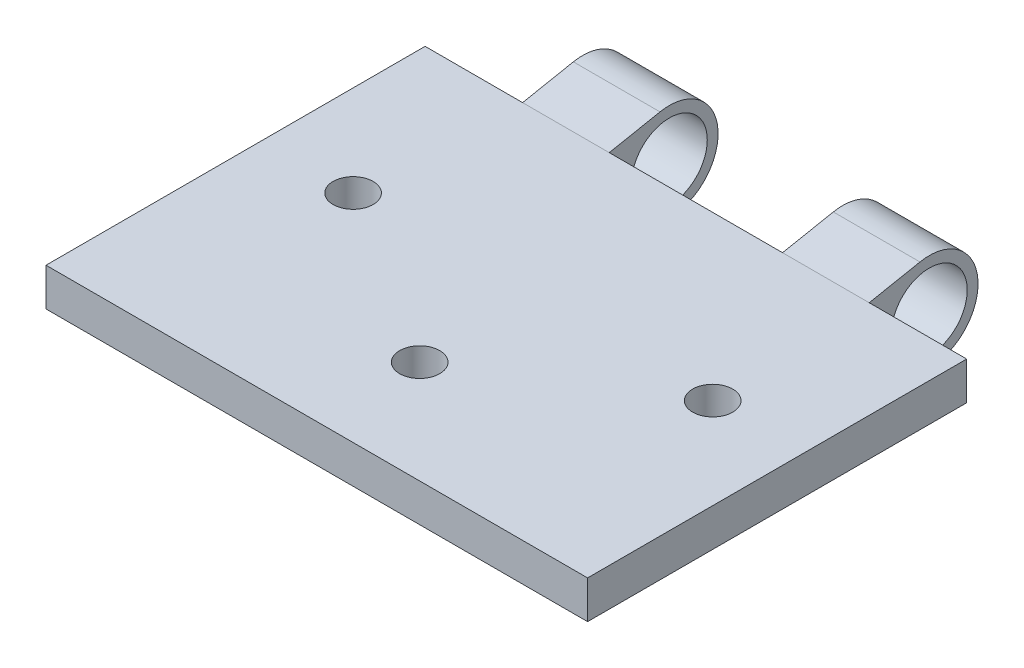
ISO-10303-21;
HEADER;
FILE_DESCRIPTION(('STEP AP214'),'2;1');
FILE_NAME('part.step','',(''),(''),'','','');
FILE_SCHEMA(('AUTOMOTIVE_DESIGN { 1 0 10303 214 1 1 1 1 }'));
ENDSEC;
DATA;
#1=APPLICATION_CONTEXT('core data for automotive mechanical design processes');
#2=APPLICATION_PROTOCOL_DEFINITION('international standard','automotive_design',2000,#1);
#3=PRODUCT_CONTEXT('',#1,'mechanical');
#4=PRODUCT('Part','Part','',(#3));
#5=PRODUCT_RELATED_PRODUCT_CATEGORY('part','',(#4));
#6=PRODUCT_DEFINITION_FORMATION('','',#4);
#7=PRODUCT_DEFINITION_CONTEXT('part definition',#1,'design');
#8=PRODUCT_DEFINITION('design','',#6,#7);
#9=PRODUCT_DEFINITION_SHAPE('','',#8);
#10=(LENGTH_UNIT() NAMED_UNIT(*) SI_UNIT(.MILLI.,.METRE.));
#11=(NAMED_UNIT(*) PLANE_ANGLE_UNIT() SI_UNIT($,.RADIAN.));
#12=(NAMED_UNIT(*) SI_UNIT($,.STERADIAN.) SOLID_ANGLE_UNIT());
#13=UNCERTAINTY_MEASURE_WITH_UNIT(LENGTH_MEASURE(1.E-05),#10,'distance_accuracy_value','');
#14=(GEOMETRIC_REPRESENTATION_CONTEXT(3) GLOBAL_UNCERTAINTY_ASSIGNED_CONTEXT((#13)) GLOBAL_UNIT_ASSIGNED_CONTEXT((#10,
#11,#12)) REPRESENTATION_CONTEXT('',''));
#15=CARTESIAN_POINT('',(0.,0.,0.));
#16=DIRECTION('',(0.,0.,1.));
#17=DIRECTION('',(1.,0.,0.));
#18=AXIS2_PLACEMENT_3D('',#15,#16,#17);
#19=CARTESIAN_POINT('',(-25.,3.5,-17.5));
#20=DIRECTION('',(0.,0.,-1.));
#21=DIRECTION('',(-1.,0.,0.));
#22=AXIS2_PLACEMENT_3D('',#19,#20,#21);
#23=PLANE('',#22);
#24=DIRECTION('',(1.,0.,0.));
#25=VECTOR('',#24,1.);
#26=CARTESIAN_POINT('',(-25.,0.,-17.5));
#27=LINE('',#26,#25);
#28=CARTESIAN_POINT('',(-8.00000000000001,0.,-17.5));
#29=VERTEX_POINT('',#28);
#30=CARTESIAN_POINT('',(7.99999999999999,0.,-17.5));
#31=VERTEX_POINT('',#30);
#32=EDGE_CURVE('E265',#29,#31,#27,.T.);
#33=ORIENTED_EDGE('',*,*,#32,.F.);
#34=DIRECTION('',(0.,-1.,0.));
#35=VECTOR('',#34,1.);
#36=CARTESIAN_POINT('',(-8.,3.5,-17.5));
#37=LINE('',#36,#35);
#38=CARTESIAN_POINT('',(-8.,3.5,-17.5));
#39=VERTEX_POINT('',#38);
#40=EDGE_CURVE('E240',#39,#29,#37,.T.);
#41=ORIENTED_EDGE('',*,*,#40,.F.);
#42=DIRECTION('',(1.,0.,0.));
#43=VECTOR('',#42,1.);
#44=CARTESIAN_POINT('',(-25.,3.5,-17.5));
#45=LINE('',#44,#43);
#46=CARTESIAN_POINT('',(7.99999999999999,3.5,-17.5));
#47=VERTEX_POINT('',#46);
#48=EDGE_CURVE('E155',#39,#47,#45,.T.);
#49=ORIENTED_EDGE('',*,*,#48,.T.);
#50=DIRECTION('',(0.,-1.,0.));
#51=VECTOR('',#50,1.);
#52=CARTESIAN_POINT('',(8.,3.5,-17.5));
#53=LINE('',#52,#51);
#54=EDGE_CURVE('E213',#47,#31,#53,.T.);
#55=ORIENTED_EDGE('',*,*,#54,.T.);
#56=EDGE_LOOP('',(#33,#41,#49,#55));
#57=FACE_BOUND('',#56,.T.);
#58=ADVANCED_FACE('F33',(#57),#23,.T.);
#59=DIRECTION('',(0.,-1.,0.));
#60=VECTOR('',#59,1.);
#61=CARTESIAN_POINT('',(-16.,3.5,-17.5));
#62=LINE('',#61,#60);
#63=CARTESIAN_POINT('',(-16.,3.5,-17.5));
#64=VERTEX_POINT('',#63);
#65=CARTESIAN_POINT('',(-16.,0.,-17.5));
#66=VERTEX_POINT('',#65);
#67=EDGE_CURVE('E125',#64,#66,#62,.T.);
#68=ORIENTED_EDGE('',*,*,#67,.T.);
#69=CARTESIAN_POINT('',(-25.,0.,-17.5));
#70=VERTEX_POINT('',#69);
#71=EDGE_CURVE('E269',#70,#66,#27,.T.);
#72=ORIENTED_EDGE('',*,*,#71,.F.);
#73=DIRECTION('',(0.,-1.,0.));
#74=VECTOR('',#73,1.);
#75=CARTESIAN_POINT('',(-25.,3.5,-17.5));
#76=LINE('',#75,#74);
#77=CARTESIAN_POINT('',(-25.,3.5,-17.5));
#78=VERTEX_POINT('',#77);
#79=EDGE_CURVE('E37',#78,#70,#76,.T.);
#80=ORIENTED_EDGE('',*,*,#79,.F.);
#81=EDGE_CURVE('E152',#78,#64,#45,.T.);
#82=ORIENTED_EDGE('',*,*,#81,.T.);
#83=EDGE_LOOP('',(#68,#72,#80,#82));
#84=FACE_BOUND('',#83,.T.);
#85=ADVANCED_FACE('F158',(#84),#23,.T.);
#86=CARTESIAN_POINT('',(-25.,3.5,17.5));
#87=DIRECTION('',(-1.,0.,0.));
#88=DIRECTION('',(0.,0.,1.));
#89=AXIS2_PLACEMENT_3D('',#86,#87,#88);
#90=PLANE('',#89);
#91=DIRECTION('',(0.,0.,-1.));
#92=VECTOR('',#91,1.);
#93=CARTESIAN_POINT('',(-25.,0.,17.5));
#94=LINE('',#93,#92);
#95=CARTESIAN_POINT('',(-25.,0.,17.5));
#96=VERTEX_POINT('',#95);
#97=EDGE_CURVE('E194',#96,#70,#94,.T.);
#98=ORIENTED_EDGE('',*,*,#97,.F.);
#99=DIRECTION('',(0.,-1.,0.));
#100=VECTOR('',#99,1.);
#101=CARTESIAN_POINT('',(-25.,3.5,17.5));
#102=LINE('',#101,#100);
#103=CARTESIAN_POINT('',(-25.,3.5,17.5));
#104=VERTEX_POINT('',#103);
#105=EDGE_CURVE('E11',#104,#96,#102,.T.);
#106=ORIENTED_EDGE('',*,*,#105,.F.);
#107=DIRECTION('',(0.,0.,-1.));
#108=VECTOR('',#107,1.);
#109=CARTESIAN_POINT('',(-25.,3.5,17.5));
#110=LINE('',#109,#108);
#111=EDGE_CURVE('E166',#104,#78,#110,.T.);
#112=ORIENTED_EDGE('',*,*,#111,.T.);
#113=ORIENTED_EDGE('',*,*,#79,.T.);
#114=EDGE_LOOP('',(#98,#106,#112,#113));
#115=FACE_BOUND('',#114,.T.);
#116=ADVANCED_FACE('F35',(#115),#90,.T.);
#117=CARTESIAN_POINT('',(25.,3.5,17.5));
#118=DIRECTION('',(0.,0.,1.));
#119=DIRECTION('',(1.,0.,0.));
#120=AXIS2_PLACEMENT_3D('',#117,#118,#119);
#121=PLANE('',#120);
#122=DIRECTION('',(-1.,0.,0.));
#123=VECTOR('',#122,1.);
#124=CARTESIAN_POINT('',(25.,0.,17.5));
#125=LINE('',#124,#123);
#126=CARTESIAN_POINT('',(25.,0.,17.5));
#127=VERTEX_POINT('',#126);
#128=EDGE_CURVE('E169',#127,#96,#125,.T.);
#129=ORIENTED_EDGE('',*,*,#128,.F.);
#130=DIRECTION('',(0.,-1.,0.));
#131=VECTOR('',#130,1.);
#132=CARTESIAN_POINT('',(25.,3.5,17.5));
#133=LINE('',#132,#131);
#134=CARTESIAN_POINT('',(25.,3.5,17.5));
#135=VERTEX_POINT('',#134);
#136=EDGE_CURVE('E42',#135,#127,#133,.T.);
#137=ORIENTED_EDGE('',*,*,#136,.F.);
#138=DIRECTION('',(-1.,0.,0.));
#139=VECTOR('',#138,1.);
#140=CARTESIAN_POINT('',(25.,3.5,17.5));
#141=LINE('',#140,#139);
#142=EDGE_CURVE('E163',#135,#104,#141,.T.);
#143=ORIENTED_EDGE('',*,*,#142,.T.);
#144=ORIENTED_EDGE('',*,*,#105,.T.);
#145=EDGE_LOOP('',(#129,#137,#143,#144));
#146=FACE_BOUND('',#145,.T.);
#147=ADVANCED_FACE('F301',(#146),#121,.T.);
#148=CARTESIAN_POINT('',(25.,3.5,-17.5));
#149=DIRECTION('',(1.,0.,0.));
#150=DIRECTION('',(0.,0.,-1.));
#151=AXIS2_PLACEMENT_3D('',#148,#149,#150);
#152=PLANE('',#151);
#153=DIRECTION('',(0.,0.,1.));
#154=VECTOR('',#153,1.);
#155=CARTESIAN_POINT('',(25.,0.,-17.5));
#156=LINE('',#155,#154);
#157=CARTESIAN_POINT('',(25.,0.,-17.5));
#158=VERTEX_POINT('',#157);
#159=EDGE_CURVE('E172',#158,#127,#156,.T.);
#160=ORIENTED_EDGE('',*,*,#159,.F.);
#161=DIRECTION('',(0.,-1.,0.));
#162=VECTOR('',#161,1.);
#163=CARTESIAN_POINT('',(25.,3.5,-17.5));
#164=LINE('',#163,#162);
#165=CARTESIAN_POINT('',(25.,3.5,-17.5));
#166=VERTEX_POINT('',#165);
#167=EDGE_CURVE('E490',#166,#158,#164,.T.);
#168=ORIENTED_EDGE('',*,*,#167,.F.);
#169=DIRECTION('',(0.,0.,1.));
#170=VECTOR('',#169,1.);
#171=CARTESIAN_POINT('',(25.,3.5,-17.5));
#172=LINE('',#171,#170);
#173=EDGE_CURVE('E159',#166,#135,#172,.T.);
#174=ORIENTED_EDGE('',*,*,#173,.T.);
#175=ORIENTED_EDGE('',*,*,#136,.T.);
#176=EDGE_LOOP('',(#160,#168,#174,#175));
#177=FACE_BOUND('',#176,.T.);
#178=ADVANCED_FACE('F294',(#177),#152,.T.);
#179=DIRECTION('',(0.,-1.,0.));
#180=VECTOR('',#179,1.);
#181=CARTESIAN_POINT('',(16.,3.5,-17.5));
#182=LINE('',#181,#180);
#183=CARTESIAN_POINT('',(16.,3.5,-17.5));
#184=VERTEX_POINT('',#183);
#185=CARTESIAN_POINT('',(16.,0.,-17.5));
#186=VERTEX_POINT('',#185);
#187=EDGE_CURVE('E58',#184,#186,#182,.T.);
#188=ORIENTED_EDGE('',*,*,#187,.F.);
#189=EDGE_CURVE('E161',#184,#166,#45,.T.);
#190=ORIENTED_EDGE('',*,*,#189,.T.);
#191=ORIENTED_EDGE('',*,*,#167,.T.);
#192=EDGE_CURVE('E270',#186,#158,#27,.T.);
#193=ORIENTED_EDGE('',*,*,#192,.F.);
#194=EDGE_LOOP('',(#188,#190,#191,#193));
#195=FACE_BOUND('',#194,.T.);
#196=ADVANCED_FACE('F288',(#195),#23,.T.);
#197=CARTESIAN_POINT('',(0.,3.5,0.));
#198=DIRECTION('',(0.,-1.,0.));
#199=DIRECTION('',(0.,0.,-1.));
#200=AXIS2_PLACEMENT_3D('',#197,#198,#199);
#201=PLANE('',#200);
#202=CARTESIAN_POINT('',(-16.6,3.5,-2.45));
#203=DIRECTION('',(0.,1.,0.));
#204=DIRECTION('',(0.,0.,1.));
#205=AXIS2_PLACEMENT_3D('',#202,#203,#204);
#206=CIRCLE('',#205,1.85);
#207=CARTESIAN_POINT('',(-16.6,3.5,-0.599999999999999));
#208=VERTEX_POINT('',#207);
#209=EDGE_CURVE('E188',#208,#208,#206,.T.);
#210=ORIENTED_EDGE('',*,*,#209,.F.);
#211=EDGE_LOOP('',(#210));
#212=FACE_BOUND('',#211,.T.);
#213=CARTESIAN_POINT('',(0.,3.5,8.));
#214=DIRECTION('',(0.,1.,0.));
#215=DIRECTION('',(0.,0.,1.));
#216=AXIS2_PLACEMENT_3D('',#213,#214,#215);
#217=CIRCLE('',#216,1.85);
#218=CARTESIAN_POINT('',(0.,3.5,9.85));
#219=VERTEX_POINT('',#218);
#220=EDGE_CURVE('E182',#219,#219,#217,.T.);
#221=ORIENTED_EDGE('',*,*,#220,.F.);
#222=EDGE_LOOP('',(#221));
#223=FACE_BOUND('',#222,.T.);
#224=CARTESIAN_POINT('',(16.6,3.5,-2.45));
#225=DIRECTION('',(0.,1.,0.));
#226=DIRECTION('',(0.,0.,1.));
#227=AXIS2_PLACEMENT_3D('',#224,#225,#226);
#228=CIRCLE('',#227,1.85);
#229=CARTESIAN_POINT('',(16.6,3.5,-0.600000000000003));
#230=VERTEX_POINT('',#229);
#231=EDGE_CURVE('E175',#230,#230,#228,.T.);
#232=ORIENTED_EDGE('',*,*,#231,.F.);
#233=EDGE_LOOP('',(#232));
#234=FACE_BOUND('',#233,.T.);
#235=ORIENTED_EDGE('',*,*,#111,.F.);
#236=ORIENTED_EDGE('',*,*,#142,.F.);
#237=ORIENTED_EDGE('',*,*,#173,.F.);
#238=ORIENTED_EDGE('',*,*,#189,.F.);
#239=DIRECTION('',(-1.,0.,0.));
#240=VECTOR('',#239,1.);
#241=CARTESIAN_POINT('',(16.,3.5,-17.5));
#242=LINE('',#241,#240);
#243=EDGE_CURVE('E203',#184,#47,#242,.T.);
#244=ORIENTED_EDGE('',*,*,#243,.T.);
#245=ORIENTED_EDGE('',*,*,#48,.F.);
#246=DIRECTION('',(1.,0.,0.));
#247=VECTOR('',#246,1.);
#248=CARTESIAN_POINT('',(-16.,3.5,-17.5));
#249=LINE('',#248,#247);
#250=EDGE_CURVE('E142',#64,#39,#249,.T.);
#251=ORIENTED_EDGE('',*,*,#250,.F.);
#252=ORIENTED_EDGE('',*,*,#81,.F.);
#253=EDGE_LOOP('',(#235,#236,#237,#238,#244,#245,#251,#252));
#254=FACE_BOUND('',#253,.T.);
#255=ADVANCED_FACE('F151',(#212,#223,#234,#254),#201,.F.);
#256=CARTESIAN_POINT('',(0.,0.,0.));
#257=DIRECTION('',(0.,-1.,0.));
#258=DIRECTION('',(0.,0.,-1.));
#259=AXIS2_PLACEMENT_3D('',#256,#257,#258);
#260=PLANE('',#259);
#261=CARTESIAN_POINT('',(-16.6,0.,-2.45));
#262=DIRECTION('',(0.,1.,0.));
#263=DIRECTION('',(0.,0.,1.));
#264=AXIS2_PLACEMENT_3D('',#261,#262,#263);
#265=CIRCLE('',#264,1.85);
#266=CARTESIAN_POINT('',(-16.6,0.,-0.599999999999999));
#267=VERTEX_POINT('',#266);
#268=EDGE_CURVE('E191',#267,#267,#265,.T.);
#269=ORIENTED_EDGE('',*,*,#268,.T.);
#270=EDGE_LOOP('',(#269));
#271=FACE_BOUND('',#270,.T.);
#272=CARTESIAN_POINT('',(0.,0.,8.));
#273=DIRECTION('',(0.,1.,0.));
#274=DIRECTION('',(0.,0.,1.));
#275=AXIS2_PLACEMENT_3D('',#272,#273,#274);
#276=CIRCLE('',#275,1.85);
#277=CARTESIAN_POINT('',(0.,0.,9.85));
#278=VERTEX_POINT('',#277);
#279=EDGE_CURVE('E185',#278,#278,#276,.T.);
#280=ORIENTED_EDGE('',*,*,#279,.T.);
#281=EDGE_LOOP('',(#280));
#282=FACE_BOUND('',#281,.T.);
#283=CARTESIAN_POINT('',(16.6,0.,-2.45));
#284=DIRECTION('',(0.,1.,0.));
#285=DIRECTION('',(0.,0.,1.));
#286=AXIS2_PLACEMENT_3D('',#283,#284,#285);
#287=CIRCLE('',#286,1.85);
#288=CARTESIAN_POINT('',(16.6,0.,-0.600000000000003));
#289=VERTEX_POINT('',#288);
#290=EDGE_CURVE('E178',#289,#289,#287,.T.);
#291=ORIENTED_EDGE('',*,*,#290,.T.);
#292=EDGE_LOOP('',(#291));
#293=FACE_BOUND('',#292,.T.);
#294=ORIENTED_EDGE('',*,*,#97,.T.);
#295=ORIENTED_EDGE('',*,*,#71,.T.);
#296=DIRECTION('',(1.,0.,0.));
#297=VECTOR('',#296,1.);
#298=CARTESIAN_POINT('',(-16.,0.,-17.5));
#299=LINE('',#298,#297);
#300=EDGE_CURVE('E231',#66,#29,#299,.T.);
#301=ORIENTED_EDGE('',*,*,#300,.T.);
#302=ORIENTED_EDGE('',*,*,#32,.T.);
#303=DIRECTION('',(-1.,0.,0.));
#304=VECTOR('',#303,1.);
#305=CARTESIAN_POINT('',(16.,0.,-17.5));
#306=LINE('',#305,#304);
#307=EDGE_CURVE('E179',#186,#31,#306,.T.);
#308=ORIENTED_EDGE('',*,*,#307,.F.);
#309=ORIENTED_EDGE('',*,*,#192,.T.);
#310=ORIENTED_EDGE('',*,*,#159,.T.);
#311=ORIENTED_EDGE('',*,*,#128,.T.);
#312=EDGE_LOOP('',(#294,#295,#301,#302,#308,#309,#310,#311));
#313=FACE_BOUND('',#312,.T.);
#314=ADVANCED_FACE('F273',(#271,#282,#293,#313),#260,.T.);
#315=CARTESIAN_POINT('',(16.6,0.,-2.45));
#316=DIRECTION('',(0.,1.,0.));
#317=DIRECTION('',(0.,0.,1.));
#318=AXIS2_PLACEMENT_3D('',#315,#316,#317);
#319=CYLINDRICAL_SURFACE('',#318,1.85);
#320=ORIENTED_EDGE('',*,*,#290,.F.);
#321=EDGE_LOOP('',(#320));
#322=FACE_BOUND('',#321,.T.);
#323=ORIENTED_EDGE('',*,*,#231,.T.);
#324=EDGE_LOOP('',(#323));
#325=FACE_BOUND('',#324,.T.);
#326=ADVANCED_FACE('F311',(#322,#325),#319,.F.);
#327=CARTESIAN_POINT('',(0.,0.,8.));
#328=DIRECTION('',(0.,1.,0.));
#329=DIRECTION('',(0.,0.,1.));
#330=AXIS2_PLACEMENT_3D('',#327,#328,#329);
#331=CYLINDRICAL_SURFACE('',#330,1.85);
#332=ORIENTED_EDGE('',*,*,#279,.F.);
#333=EDGE_LOOP('',(#332));
#334=FACE_BOUND('',#333,.T.);
#335=ORIENTED_EDGE('',*,*,#220,.T.);
#336=EDGE_LOOP('',(#335));
#337=FACE_BOUND('',#336,.T.);
#338=ADVANCED_FACE('F316',(#334,#337),#331,.F.);
#339=CARTESIAN_POINT('',(-16.6,0.,-2.45));
#340=DIRECTION('',(0.,1.,0.));
#341=DIRECTION('',(0.,0.,1.));
#342=AXIS2_PLACEMENT_3D('',#339,#340,#341);
#343=CYLINDRICAL_SURFACE('',#342,1.85);
#344=ORIENTED_EDGE('',*,*,#268,.F.);
#345=EDGE_LOOP('',(#344));
#346=FACE_BOUND('',#345,.T.);
#347=ORIENTED_EDGE('',*,*,#209,.T.);
#348=EDGE_LOOP('',(#347));
#349=FACE_BOUND('',#348,.T.);
#350=ADVANCED_FACE('F320',(#346,#349),#343,.F.);
#351=CARTESIAN_POINT('',(16.,0.,-23.05));
#352=DIRECTION('',(1.,0.,0.));
#353=DIRECTION('',(0.,0.,-1.));
#354=AXIS2_PLACEMENT_3D('',#351,#352,#353);
#355=PLANE('',#354);
#356=ORIENTED_EDGE('',*,*,#187,.T.);
#357=DIRECTION('',(0.,-0.810810810810812,-0.585308319667775));
#358=VECTOR('',#357,1.);
#359=CARTESIAN_POINT('',(16.,0.,-17.5));
#360=LINE('',#359,#358);
#361=CARTESIAN_POINT('',(16.,-2.63388743850499,-19.4013513513513));
#362=VERTEX_POINT('',#361);
#363=EDGE_CURVE('E221',#186,#362,#360,.T.);
#364=ORIENTED_EDGE('',*,*,#363,.T.);
#365=CARTESIAN_POINT('',(16.,0.,-23.05));
#366=DIRECTION('',(1.,0.,0.));
#367=DIRECTION('',(0.,0.,-1.));
#368=AXIS2_PLACEMENT_3D('',#365,#366,#367);
#369=CIRCLE('',#368,4.5);
#370=CARTESIAN_POINT('',(16.,4.41636440085435,-22.1864460185568));
#371=VERTEX_POINT('',#370);
#372=EDGE_CURVE('E219',#362,#371,#369,.T.);
#373=ORIENTED_EDGE('',*,*,#372,.T.);
#374=DIRECTION('',(0.,-0.191900884765156,0.981414311300966));
#375=VECTOR('',#374,1.);
#376=CARTESIAN_POINT('',(16.,3.5,-17.5));
#377=LINE('',#376,#375);
#378=EDGE_CURVE('E205',#371,#184,#377,.T.);
#379=ORIENTED_EDGE('',*,*,#378,.T.);
#380=EDGE_LOOP('',(#356,#364,#373,#379));
#381=FACE_BOUND('',#380,.T.);
#382=CARTESIAN_POINT('',(16.,0.,-23.05));
#383=DIRECTION('',(1.,0.,0.));
#384=DIRECTION('',(0.,0.,-1.));
#385=AXIS2_PLACEMENT_3D('',#382,#383,#384);
#386=CIRCLE('',#385,3.5);
#387=CARTESIAN_POINT('',(16.,0.,-26.55));
#388=VERTEX_POINT('',#387);
#389=EDGE_CURVE('E216',#388,#388,#386,.T.);
#390=ORIENTED_EDGE('',*,*,#389,.F.);
#391=EDGE_LOOP('',(#390));
#392=FACE_BOUND('',#391,.T.);
#393=ADVANCED_FACE('F324',(#381,#392),#355,.T.);
#394=CARTESIAN_POINT('',(8.,0.,-23.05));
#395=DIRECTION('',(1.,0.,0.));
#396=DIRECTION('',(0.,0.,-1.));
#397=AXIS2_PLACEMENT_3D('',#394,#395,#396);
#398=PLANE('',#397);
#399=ORIENTED_EDGE('',*,*,#54,.F.);
#400=DIRECTION('',(0.,-0.191900884765156,0.981414311300966));
#401=VECTOR('',#400,1.);
#402=CARTESIAN_POINT('',(8.,3.5,-17.5));
#403=LINE('',#402,#401);
#404=CARTESIAN_POINT('',(8.,4.41636440085435,-22.1864460185568));
#405=VERTEX_POINT('',#404);
#406=EDGE_CURVE('E206',#405,#47,#403,.T.);
#407=ORIENTED_EDGE('',*,*,#406,.F.);
#408=CARTESIAN_POINT('',(8.,0.,-23.05));
#409=DIRECTION('',(1.,0.,0.));
#410=DIRECTION('',(0.,0.,-1.));
#411=AXIS2_PLACEMENT_3D('',#408,#409,#410);
#412=CIRCLE('',#411,4.5);
#413=CARTESIAN_POINT('',(8.,-2.63388743850499,-19.4013513513513));
#414=VERTEX_POINT('',#413);
#415=EDGE_CURVE('E209',#414,#405,#412,.T.);
#416=ORIENTED_EDGE('',*,*,#415,.F.);
#417=DIRECTION('',(0.,-0.810810810810812,-0.585308319667775));
#418=VECTOR('',#417,1.);
#419=CARTESIAN_POINT('',(8.,0.,-17.5));
#420=LINE('',#419,#418);
#421=EDGE_CURVE('E211',#31,#414,#420,.T.);
#422=ORIENTED_EDGE('',*,*,#421,.F.);
#423=EDGE_LOOP('',(#399,#407,#416,#422));
#424=FACE_BOUND('',#423,.T.);
#425=CARTESIAN_POINT('',(8.,0.,-23.05));
#426=DIRECTION('',(1.,0.,0.));
#427=DIRECTION('',(0.,0.,-1.));
#428=AXIS2_PLACEMENT_3D('',#425,#426,#427);
#429=CIRCLE('',#428,3.5);
#430=CARTESIAN_POINT('',(8.,0.,-26.55));
#431=VERTEX_POINT('',#430);
#432=EDGE_CURVE('E156',#431,#431,#429,.T.);
#433=ORIENTED_EDGE('',*,*,#432,.T.);
#434=EDGE_LOOP('',(#433));
#435=FACE_BOUND('',#434,.T.);
#436=ADVANCED_FACE('F330',(#424,#435),#398,.F.);
#437=CARTESIAN_POINT('',(16.,0.,-17.5));
#438=DIRECTION('',(0.,0.585308319667775,-0.810810810810812));
#439=DIRECTION('',(0.,0.810810810810812,0.585308319667775));
#440=AXIS2_PLACEMENT_3D('',#437,#438,#439);
#441=PLANE('',#440);
#442=ORIENTED_EDGE('',*,*,#421,.T.);
#443=DIRECTION('',(-1.,0.,0.));
#444=VECTOR('',#443,1.);
#445=CARTESIAN_POINT('',(16.,-2.63388743850499,-19.4013513513513));
#446=LINE('',#445,#444);
#447=EDGE_CURVE('E197',#362,#414,#446,.T.);
#448=ORIENTED_EDGE('',*,*,#447,.F.);
#449=ORIENTED_EDGE('',*,*,#363,.F.);
#450=ORIENTED_EDGE('',*,*,#307,.T.);
#451=EDGE_LOOP('',(#442,#448,#449,#450));
#452=FACE_BOUND('',#451,.T.);
#453=ADVANCED_FACE('F326',(#452),#441,.F.);
#454=CARTESIAN_POINT('',(16.,0.,-23.05));
#455=DIRECTION('',(-1.,0.,0.));
#456=DIRECTION('',(0.,0.,1.));
#457=AXIS2_PLACEMENT_3D('',#454,#455,#456);
#458=CYLINDRICAL_SURFACE('',#457,4.5);
#459=ORIENTED_EDGE('',*,*,#415,.T.);
#460=DIRECTION('',(-1.,0.,0.));
#461=VECTOR('',#460,1.);
#462=CARTESIAN_POINT('',(16.,4.41636440085435,-22.1864460185568));
#463=LINE('',#462,#461);
#464=EDGE_CURVE('E200',#371,#405,#463,.T.);
#465=ORIENTED_EDGE('',*,*,#464,.F.);
#466=ORIENTED_EDGE('',*,*,#372,.F.);
#467=ORIENTED_EDGE('',*,*,#447,.T.);
#468=EDGE_LOOP('',(#459,#465,#466,#467));
#469=FACE_BOUND('',#468,.T.);
#470=ADVANCED_FACE('F329',(#469),#458,.T.);
#471=CARTESIAN_POINT('',(16.,3.5,-17.5));
#472=DIRECTION('',(0.,-0.981414311300966,-0.191900884765156));
#473=DIRECTION('',(0.,0.191900884765156,-0.981414311300966));
#474=AXIS2_PLACEMENT_3D('',#471,#472,#473);
#475=PLANE('',#474);
#476=ORIENTED_EDGE('',*,*,#406,.T.);
#477=ORIENTED_EDGE('',*,*,#243,.F.);
#478=ORIENTED_EDGE('',*,*,#378,.F.);
#479=ORIENTED_EDGE('',*,*,#464,.T.);
#480=EDGE_LOOP('',(#476,#477,#478,#479));
#481=FACE_BOUND('',#480,.T.);
#482=ADVANCED_FACE('F334',(#481),#475,.F.);
#483=CARTESIAN_POINT('',(16.,0.,-23.05));
#484=DIRECTION('',(-1.,0.,0.));
#485=DIRECTION('',(0.,0.,1.));
#486=AXIS2_PLACEMENT_3D('',#483,#484,#485);
#487=CYLINDRICAL_SURFACE('',#486,3.5);
#488=ORIENTED_EDGE('',*,*,#389,.T.);
#489=EDGE_LOOP('',(#488));
#490=FACE_BOUND('',#489,.T.);
#491=ORIENTED_EDGE('',*,*,#432,.F.);
#492=EDGE_LOOP('',(#491));
#493=FACE_BOUND('',#492,.T.);
#494=ADVANCED_FACE('F285',(#490,#493),#487,.F.);
#495=CARTESIAN_POINT('',(-16.,3.5,-17.5));
#496=DIRECTION('',(0.,0.981414311300966,0.191900884765156));
#497=DIRECTION('',(0.,-0.191900884765156,0.981414311300966));
#498=AXIS2_PLACEMENT_3D('',#495,#496,#497);
#499=PLANE('',#498);
#500=DIRECTION('',(0.,-0.191900884765156,0.981414311300966));
#501=VECTOR('',#500,1.);
#502=CARTESIAN_POINT('',(-8.,3.5,-17.5));
#503=LINE('',#502,#501);
#504=CARTESIAN_POINT('',(-8.,4.41636440085435,-22.1864460185568));
#505=VERTEX_POINT('',#504);
#506=EDGE_CURVE('E238',#505,#39,#503,.T.);
#507=ORIENTED_EDGE('',*,*,#506,.F.);
#508=DIRECTION('',(1.,0.,0.));
#509=VECTOR('',#508,1.);
#510=CARTESIAN_POINT('',(-16.,4.41636440085435,-22.1864460185568));
#511=LINE('',#510,#509);
#512=CARTESIAN_POINT('',(-16.,4.41636440085435,-22.1864460185568));
#513=VERTEX_POINT('',#512);
#514=EDGE_CURVE('E144',#513,#505,#511,.T.);
#515=ORIENTED_EDGE('',*,*,#514,.F.);
#516=DIRECTION('',(0.,-0.191900884765156,0.981414311300966));
#517=VECTOR('',#516,1.);
#518=CARTESIAN_POINT('',(-16.,3.5,-17.5));
#519=LINE('',#518,#517);
#520=EDGE_CURVE('E129',#513,#64,#519,.T.);
#521=ORIENTED_EDGE('',*,*,#520,.T.);
#522=ORIENTED_EDGE('',*,*,#250,.T.);
#523=EDGE_LOOP('',(#507,#515,#521,#522));
#524=FACE_BOUND('',#523,.T.);
#525=ADVANCED_FACE('F141',(#524),#499,.T.);
#526=CARTESIAN_POINT('',(-16.,0.,-23.05));
#527=DIRECTION('',(1.,0.,0.));
#528=DIRECTION('',(0.,0.,-1.));
#529=AXIS2_PLACEMENT_3D('',#526,#527,#528);
#530=CYLINDRICAL_SURFACE('',#529,4.5);
#531=CARTESIAN_POINT('',(-8.,0.,-23.05));
#532=DIRECTION('',(1.,0.,0.));
#533=DIRECTION('',(0.,0.,-1.));
#534=AXIS2_PLACEMENT_3D('',#531,#532,#533);
#535=CIRCLE('',#534,4.5);
#536=CARTESIAN_POINT('',(-8.,-2.63388743850499,-19.4013513513513));
#537=VERTEX_POINT('',#536);
#538=EDGE_CURVE('E235',#537,#505,#535,.T.);
#539=ORIENTED_EDGE('',*,*,#538,.F.);
#540=DIRECTION('',(1.,0.,0.));
#541=VECTOR('',#540,1.);
#542=CARTESIAN_POINT('',(-16.,-2.63388743850499,-19.4013513513513));
#543=LINE('',#542,#541);
#544=CARTESIAN_POINT('',(-16.,-2.63388743850499,-19.4013513513513));
#545=VERTEX_POINT('',#544);
#546=EDGE_CURVE('E229',#545,#537,#543,.T.);
#547=ORIENTED_EDGE('',*,*,#546,.F.);
#548=CARTESIAN_POINT('',(-16.,0.,-23.05));
#549=DIRECTION('',(1.,0.,0.));
#550=DIRECTION('',(0.,0.,-1.));
#551=AXIS2_PLACEMENT_3D('',#548,#549,#550);
#552=CIRCLE('',#551,4.5);
#553=EDGE_CURVE('E145',#545,#513,#552,.T.);
#554=ORIENTED_EDGE('',*,*,#553,.T.);
#555=ORIENTED_EDGE('',*,*,#514,.T.);
#556=EDGE_LOOP('',(#539,#547,#554,#555));
#557=FACE_BOUND('',#556,.T.);
#558=ADVANCED_FACE('F277',(#557),#530,.T.);
#559=CARTESIAN_POINT('',(-16.,0.,-17.5));
#560=DIRECTION('',(0.,-0.585308319667775,0.810810810810812));
#561=DIRECTION('',(0.,-0.810810810810812,-0.585308319667775));
#562=AXIS2_PLACEMENT_3D('',#559,#560,#561);
#563=PLANE('',#562);
#564=DIRECTION('',(0.,-0.810810810810812,-0.585308319667775));
#565=VECTOR('',#564,1.);
#566=CARTESIAN_POINT('',(-8.,0.,-17.5));
#567=LINE('',#566,#565);
#568=EDGE_CURVE('E50',#29,#537,#567,.T.);
#569=ORIENTED_EDGE('',*,*,#568,.F.);
#570=ORIENTED_EDGE('',*,*,#300,.F.);
#571=DIRECTION('',(0.,-0.810810810810812,-0.585308319667775));
#572=VECTOR('',#571,1.);
#573=CARTESIAN_POINT('',(-16.,0.,-17.5));
#574=LINE('',#573,#572);
#575=EDGE_CURVE('E132',#66,#545,#574,.T.);
#576=ORIENTED_EDGE('',*,*,#575,.T.);
#577=ORIENTED_EDGE('',*,*,#546,.T.);
#578=EDGE_LOOP('',(#569,#570,#576,#577));
#579=FACE_BOUND('',#578,.T.);
#580=ADVANCED_FACE('F274',(#579),#563,.T.);
#581=CARTESIAN_POINT('',(-16.,0.,-23.05));
#582=DIRECTION('',(-1.,0.,0.));
#583=DIRECTION('',(0.,0.,-1.));
#584=AXIS2_PLACEMENT_3D('',#581,#582,#583);
#585=PLANE('',#584);
#586=CARTESIAN_POINT('',(-16.,0.,-23.05));
#587=DIRECTION('',(1.,0.,0.));
#588=DIRECTION('',(0.,0.,-1.));
#589=AXIS2_PLACEMENT_3D('',#586,#587,#588);
#590=CIRCLE('',#589,3.5);
#591=CARTESIAN_POINT('',(-16.,0.,-26.55));
#592=VERTEX_POINT('',#591);
#593=EDGE_CURVE('E242',#592,#592,#590,.T.);
#594=ORIENTED_EDGE('',*,*,#593,.T.);
#595=EDGE_LOOP('',(#594));
#596=FACE_BOUND('',#595,.T.);
#597=ORIENTED_EDGE('',*,*,#67,.F.);
#598=ORIENTED_EDGE('',*,*,#520,.F.);
#599=ORIENTED_EDGE('',*,*,#553,.F.);
#600=ORIENTED_EDGE('',*,*,#575,.F.);
#601=EDGE_LOOP('',(#597,#598,#599,#600));
#602=FACE_BOUND('',#601,.T.);
#603=ADVANCED_FACE('F127',(#596,#602),#585,.T.);
#604=CARTESIAN_POINT('',(-8.,0.,-23.05));
#605=DIRECTION('',(-1.,0.,0.));
#606=DIRECTION('',(0.,0.,-1.));
#607=AXIS2_PLACEMENT_3D('',#604,#605,#606);
#608=PLANE('',#607);
#609=CARTESIAN_POINT('',(-8.,0.,-23.05));
#610=DIRECTION('',(1.,0.,0.));
#611=DIRECTION('',(0.,0.,-1.));
#612=AXIS2_PLACEMENT_3D('',#609,#610,#611);
#613=CIRCLE('',#612,3.5);
#614=CARTESIAN_POINT('',(-8.,0.,-26.55));
#615=VERTEX_POINT('',#614);
#616=EDGE_CURVE('E245',#615,#615,#613,.T.);
#617=ORIENTED_EDGE('',*,*,#616,.F.);
#618=EDGE_LOOP('',(#617));
#619=FACE_BOUND('',#618,.T.);
#620=ORIENTED_EDGE('',*,*,#40,.T.);
#621=ORIENTED_EDGE('',*,*,#568,.T.);
#622=ORIENTED_EDGE('',*,*,#538,.T.);
#623=ORIENTED_EDGE('',*,*,#506,.T.);
#624=EDGE_LOOP('',(#620,#621,#622,#623));
#625=FACE_BOUND('',#624,.T.);
#626=ADVANCED_FACE('F255',(#619,#625),#608,.F.);
#627=CARTESIAN_POINT('',(-16.,0.,-23.05));
#628=DIRECTION('',(1.,0.,0.));
#629=DIRECTION('',(0.,0.,-1.));
#630=AXIS2_PLACEMENT_3D('',#627,#628,#629);
#631=CYLINDRICAL_SURFACE('',#630,3.5);
#632=ORIENTED_EDGE('',*,*,#593,.F.);
#633=EDGE_LOOP('',(#632));
#634=FACE_BOUND('',#633,.T.);
#635=ORIENTED_EDGE('',*,*,#616,.T.);
#636=EDGE_LOOP('',(#635));
#637=FACE_BOUND('',#636,.T.);
#638=ADVANCED_FACE('F252',(#634,#637),#631,.F.);
#639=CLOSED_SHELL('',(#58,#85,#116,#147,#178,#196,#255,#314,#326,#338,#350,#393,#436,#453,#470,
#482,#494,#525,#558,#580,#603,#626,#638));
#640=MANIFOLD_SOLID_BREP('B2',#639);
#641=ADVANCED_BREP_SHAPE_REPRESENTATION('',(#18,#640),#14);
#642=SHAPE_DEFINITION_REPRESENTATION(#9,#641);
ENDSEC;
END-ISO-10303-21;
